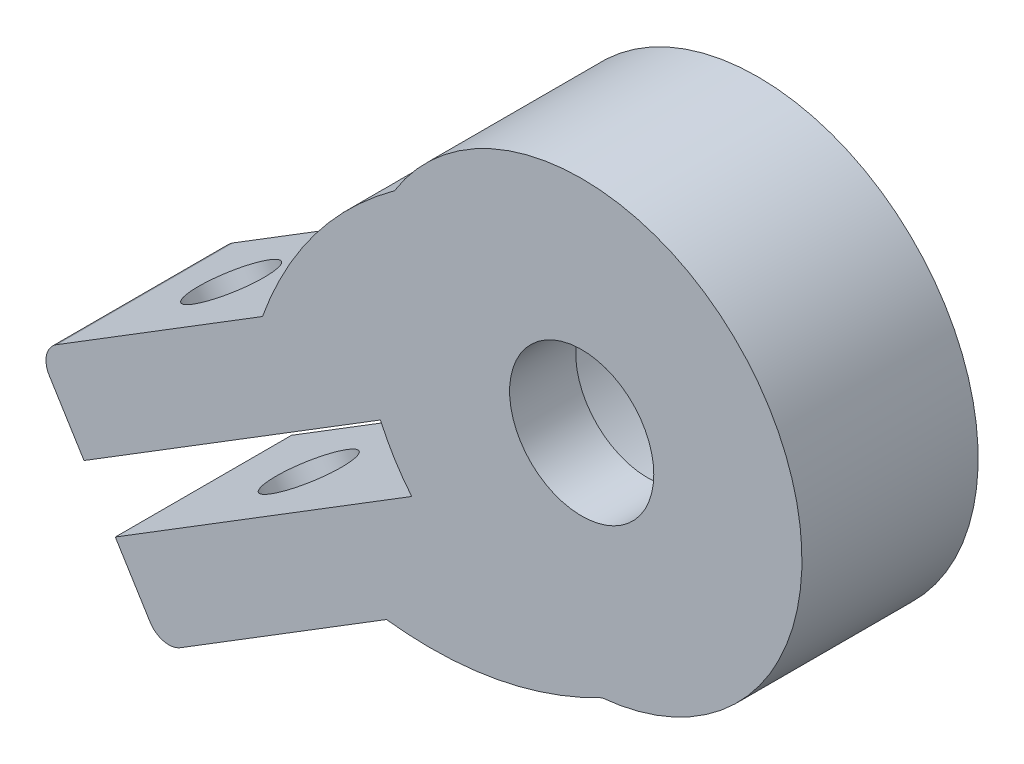
ISO-10303-21;
HEADER;
FILE_DESCRIPTION(('STEP AP214'),'2;1');
FILE_NAME('part.step','',(''),(''),'','','');
FILE_SCHEMA(('AUTOMOTIVE_DESIGN { 1 0 10303 214 1 1 1 1 }'));
ENDSEC;
DATA;
#1=APPLICATION_CONTEXT('core data for automotive mechanical design processes');
#2=APPLICATION_PROTOCOL_DEFINITION('international standard','automotive_design',2000,#1);
#3=PRODUCT_CONTEXT('',#1,'mechanical');
#4=PRODUCT('Part','Part','',(#3));
#5=PRODUCT_RELATED_PRODUCT_CATEGORY('part','',(#4));
#6=PRODUCT_DEFINITION_FORMATION('','',#4);
#7=PRODUCT_DEFINITION_CONTEXT('part definition',#1,'design');
#8=PRODUCT_DEFINITION('design','',#6,#7);
#9=PRODUCT_DEFINITION_SHAPE('','',#8);
#10=(LENGTH_UNIT() NAMED_UNIT(*) SI_UNIT(.MILLI.,.METRE.));
#11=(NAMED_UNIT(*) PLANE_ANGLE_UNIT() SI_UNIT($,.RADIAN.));
#12=(NAMED_UNIT(*) SI_UNIT($,.STERADIAN.) SOLID_ANGLE_UNIT());
#13=UNCERTAINTY_MEASURE_WITH_UNIT(LENGTH_MEASURE(1.E-05),#10,'distance_accuracy_value','');
#14=(GEOMETRIC_REPRESENTATION_CONTEXT(3) GLOBAL_UNCERTAINTY_ASSIGNED_CONTEXT((#13)) GLOBAL_UNIT_ASSIGNED_CONTEXT((#10,
#11,#12)) REPRESENTATION_CONTEXT('',''));
#15=CARTESIAN_POINT('',(0.,0.,0.));
#16=DIRECTION('',(0.,0.,1.));
#17=DIRECTION('',(1.,0.,0.));
#18=AXIS2_PLACEMENT_3D('',#15,#16,#17);
#19=CARTESIAN_POINT('',(-20.0670341495117,12.6316896438471,-1.));
#20=DIRECTION('',(0.526017539457863,-0.850473719865991,0.));
#21=DIRECTION('',(0.850473719865991,0.526017539457863,0.));
#22=AXIS2_PLACEMENT_3D('',#19,#20,#21);
#23=CYLINDRICAL_SURFACE('',#22,1.75);
#24=CARTESIAN_POINT('',(-6.04943891295383,-10.0321865012299,-1.));
#25=DIRECTION('',(0.526017539457863,-0.850473719865991,0.));
#26=DIRECTION('',(0.850473719865991,0.526017539457863,0.));
#27=AXIS2_PLACEMENT_3D('',#24,#25,#26);
#28=CIRCLE('',#27,1.75);
#29=CARTESIAN_POINT('',(-4.56110990318834,-9.11165580717864,-1.));
#30=VERTEX_POINT('',#29);
#31=EDGE_CURVE('E96',#30,#30,#28,.F.);
#32=ORIENTED_EDGE('',*,*,#31,.F.);
#33=EDGE_LOOP('',(#32));
#34=FACE_BOUND('',#33,.T.);
#35=CARTESIAN_POINT('',(-9.5737564273195,-4.33401257813101,-1.));
#36=DIRECTION('',(0.526017539457977,-0.85047371986592,0.));
#37=DIRECTION('',(0.85047371986592,0.526017539457977,0.));
#38=AXIS2_PLACEMENT_3D('',#35,#36,#37);
#39=CIRCLE('',#38,1.75);
#40=CARTESIAN_POINT('',(-9.13700509767211,-4.06388211506115,0.67295481378694));
#41=VERTEX_POINT('',#40);
#42=CARTESIAN_POINT('',(-9.13700509767211,-4.06388211506115,-2.67295481378694));
#43=VERTEX_POINT('',#42);
#44=EDGE_CURVE('E394',#41,#43,#39,.T.);
#45=ORIENTED_EDGE('',*,*,#44,.T.);
#46=CARTESIAN_POINT('',(-9.13700509767211,-4.06388211506115,-2.67295481378694));
#47=CARTESIAN_POINT('',(-9.0910607179758,-4.16718406959697,-2.67762389147435));
#48=CARTESIAN_POINT('',(-9.04335031298703,-4.26973245475617,-2.68151430251616));
#49=CARTESIAN_POINT('',(-8.94446343189451,-4.47318220112726,-2.68796334016017));
#50=CARTESIAN_POINT('',(-8.89328709475151,-4.57408362817011,-2.69052202012022));
#51=CARTESIAN_POINT('',(-8.78779013941502,-4.77361705844955,-2.69452363922069));
#52=CARTESIAN_POINT('',(-8.7334861844887,-4.87225776888833,-2.6959719922968));
#53=CARTESIAN_POINT('',(-8.62157308507197,-5.06765761053142,-2.69788924327426));
#54=CARTESIAN_POINT('',(-8.56396389140243,-5.16441671371032,-2.69835812659805));
#55=CARTESIAN_POINT('',(-8.44551050591582,-5.35593407544946,-2.69835812659804));
#56=CARTESIAN_POINT('',(-8.38466631409875,-5.45069233400969,-2.69788924327424));
#57=CARTESIAN_POINT('',(-8.25981820007442,-5.63809187605762,-2.69597199229676));
#58=CARTESIAN_POINT('',(-8.19581432490623,-5.73073319103081,-2.69452363922064));
#59=CARTESIAN_POINT('',(-8.06440225147341,-5.91423813467112,-2.69052202012015));
#60=CARTESIAN_POINT('',(-7.99697882062953,-6.00509074297654,-2.68796334016009));
#61=CARTESIAN_POINT('',(-7.85911057629518,-6.18443053709605,-2.68151430251606));
#62=CARTESIAN_POINT('',(-7.78866564184246,-6.27291762797888,-2.67762389147424));
#63=CARTESIAN_POINT('',(-7.71675774113556,-6.36016115869907,-2.67295481378682));
#64=B_SPLINE_CURVE_WITH_KNOTS('',3,(#46,#47,#48,#49,#50,#51,#52,#53,#54,#55,#56,#57,#58,#59,#60,
#61,#62,#63),.UNSPECIFIED.,.F.,.F.,(4,2,2,2,2,2,2,2,4),(0.,0.339440738920705,0.678867876579291,
1.01662925696975,1.35439566426521,1.69216207156067,2.02992345195113,2.36935058960971,
2.70879132853042),.UNSPECIFIED.);
#65=CARTESIAN_POINT('',(-7.71675774113556,-6.36016115869907,-2.67295481378682));
#66=VERTEX_POINT('',#65);
#67=EDGE_CURVE('E310',#43,#66,#64,.T.);
#68=ORIENTED_EDGE('',*,*,#67,.T.);
#69=CARTESIAN_POINT('',(-8.1535090707833,-6.63029162176914,-1.));
#70=DIRECTION('',(0.526017539457983,-0.850473719865916,0.));
#71=DIRECTION('',(0.850473719865916,0.526017539457983,0.));
#72=AXIS2_PLACEMENT_3D('',#69,#70,#71);
#73=CIRCLE('',#72,1.75);
#74=CARTESIAN_POINT('',(-7.71675774113556,-6.36016115869907,0.672954813786817));
#75=VERTEX_POINT('',#74);
#76=EDGE_CURVE('E12',#75,#66,#73,.T.);
#77=ORIENTED_EDGE('',*,*,#76,.F.);
#78=CARTESIAN_POINT('',(-7.71675774113556,-6.36016115869907,0.672954813786818));
#79=CARTESIAN_POINT('',(-7.78866564184246,-6.27291762797888,0.677623891474236));
#80=CARTESIAN_POINT('',(-7.85911057629518,-6.18443053709605,0.68151430251606));
#81=CARTESIAN_POINT('',(-7.99697882062953,-6.00509074297654,0.687963340160092));
#82=CARTESIAN_POINT('',(-8.06440225147341,-5.91423813467112,0.690522020120153));
#83=CARTESIAN_POINT('',(-8.19581432490623,-5.7307331910308,0.694523639220642));
#84=CARTESIAN_POINT('',(-8.25981820007442,-5.63809187605762,0.695971992296761));
#85=CARTESIAN_POINT('',(-8.38466631409875,-5.45069233400969,0.697889243274241));
#86=CARTESIAN_POINT('',(-8.44551050591582,-5.35593407544946,0.698358126598042));
#87=CARTESIAN_POINT('',(-8.56396389140243,-5.16441671371032,0.69835812659805));
#88=CARTESIAN_POINT('',(-8.62157308507197,-5.06765761053142,0.697889243274257));
#89=CARTESIAN_POINT('',(-8.7334861844887,-4.87225776888833,0.695971992296795));
#90=CARTESIAN_POINT('',(-8.78779013941502,-4.77361705844955,0.694523639220685));
#91=CARTESIAN_POINT('',(-8.89328709475151,-4.57408362817011,0.690522020120216));
#92=CARTESIAN_POINT('',(-8.94446343189451,-4.47318220112726,0.687963340160165));
#93=CARTESIAN_POINT('',(-9.04335031298703,-4.26973245475617,0.681514302516156));
#94=CARTESIAN_POINT('',(-9.0910607179758,-4.16718406959697,0.677623891474344));
#95=CARTESIAN_POINT('',(-9.13700509767211,-4.06388211506115,0.67295481378694));
#96=B_SPLINE_CURVE_WITH_KNOTS('',3,(#78,#79,#80,#81,#82,#83,#84,#85,#86,#87,#88,#89,#90,#91,#92,
#93,#94,#95),.UNSPECIFIED.,.F.,.F.,(4,2,2,2,2,2,2,2,4),(0.,0.339440738920706,0.678867876579291,
1.01662925696975,1.35439566426521,1.69216207156067,2.02992345195113,2.36935058960971,
2.70879132853042),.UNSPECIFIED.);
#97=EDGE_CURVE('E402',#75,#41,#96,.T.);
#98=ORIENTED_EDGE('',*,*,#97,.T.);
#99=EDGE_LOOP('',(#45,#68,#77,#98));
#100=FACE_BOUND('',#99,.T.);
#101=CARTESIAN_POINT('',(-11.6778265851506,-0.932117698667625,-1.));
#102=DIRECTION('',(-0.526017539457863,0.850473719865991,0.));
#103=DIRECTION('',(-0.850473719865991,-0.526017539457863,0.));
#104=AXIS2_PLACEMENT_3D('',#101,#102,#103);
#105=CIRCLE('',#104,1.75);
#106=CARTESIAN_POINT('',(-13.1661555949161,-1.85264839271889,-1.));
#107=VERTEX_POINT('',#106);
#108=EDGE_CURVE('E222',#107,#107,#105,.F.);
#109=ORIENTED_EDGE('',*,*,#108,.F.);
#110=EDGE_LOOP('',(#109));
#111=FACE_BOUND('',#110,.T.);
#112=ADVANCED_FACE('F91',(#34,#100,#111),#23,.F.);
#113=CARTESIAN_POINT('',(0.920254083057489,-9.95756659142259,27.838654743405));
#114=CARTESIAN_POINT('',(-3.77200392309592,-12.3784621923339,27.838654743405));
#115=CARTESIAN_POINT('',(-8.86441175084651,-11.7732456912333,27.838654743405));
#116=B_SPLINE_CURVE_WITH_KNOTS('',2,(#113,#114,#115),.UNSPECIFIED.,.F.,.F.,(3,3),(0.,1.),.UNSPECIFIED.);
#117=DIRECTION('',(0.,0.,-1.));
#118=VECTOR('',#117,1.);
#119=SURFACE_OF_LINEAR_EXTRUSION('',#116,#118);
#120=DIRECTION('',(0.,0.,-1.));
#121=VECTOR('',#120,1.);
#122=CARTESIAN_POINT('',(-8.86441175084651,-11.7732456912333,27.838654743405));
#123=LINE('',#122,#121);
#124=CARTESIAN_POINT('',(-8.86441175084651,-11.7732456912333,3.));
#125=VERTEX_POINT('',#124);
#126=CARTESIAN_POINT('',(-8.86441175084651,-11.7732456912333,0.13782284158443));
#127=VERTEX_POINT('',#126);
#128=EDGE_CURVE('E473',#125,#127,#123,.T.);
#129=ORIENTED_EDGE('',*,*,#128,.T.);
#130=CARTESIAN_POINT('',(-8.86441175084651,-11.7732456912333,0.137822841584416));
#131=CARTESIAN_POINT('',(-8.78178088037611,-11.7830759715361,0.327218545379615));
#132=CARTESIAN_POINT('',(-8.68053923373417,-11.7945229962121,0.507374773618629));
#133=CARTESIAN_POINT('',(-8.44862217109366,-11.8180616260093,0.845916567357196));
#134=CARTESIAN_POINT('',(-8.31815431394117,-11.8301482477535,1.0044435515616));
#135=CARTESIAN_POINT('',(-8.03498623870755,-11.8525225034823,1.29832846642813));
#136=CARTESIAN_POINT('',(-7.88240628702935,-11.8628192455073,1.43380362010848));
#137=CARTESIAN_POINT('',(-7.5592444828786,-11.8797205776163,1.68218934454834));
#138=CARTESIAN_POINT('',(-7.38862352391518,-11.886316943192,1.79504929565848));
#139=CARTESIAN_POINT('',(-7.00451009414908,-11.8947839717756,2.01373316801826));
#140=CARTESIAN_POINT('',(-6.78858660450014,-11.8956965307021,2.11533137487465));
#141=CARTESIAN_POINT('',(-6.343858034518,-11.8882395240412,2.28462988327816));
#142=CARTESIAN_POINT('',(-6.11505194166355,-11.8798692278891,2.35232751622647));
#143=CARTESIAN_POINT('',(-5.75872012779931,-11.8590247321965,2.42831029516039));
#144=CARTESIAN_POINT('',(-5.63361872835202,-11.850273626802,2.44958285057473));
#145=CARTESIAN_POINT('',(-5.38231487589028,-11.8297304393406,2.48135464254085));
#146=CARTESIAN_POINT('',(-5.25611287353542,-11.8179395502315,2.49185809737708));
#147=CARTESIAN_POINT('',(-5.0035883207517,-11.7913335681812,2.50168855611812));
#148=CARTESIAN_POINT('',(-4.8772657687764,-11.776518435911,2.50101541466646));
#149=CARTESIAN_POINT('',(-4.62558295174889,-11.7439929702566,2.48811938132056));
#150=CARTESIAN_POINT('',(-4.50022258516097,-11.7262829468822,2.4758977254706));
#151=CARTESIAN_POINT('',(-4.26041661028451,-11.6895610924857,2.44089096867987));
#152=CARTESIAN_POINT('',(-4.14582548101767,-11.6707295652989,2.41891296183978));
#153=CARTESIAN_POINT('',(-3.91948599055489,-11.6310786253154,2.36457896995024));
#154=CARTESIAN_POINT('',(-3.80773726635139,-11.6102594679923,2.33222431737233));
#155=CARTESIAN_POINT('',(-3.58817144120457,-11.5670346939342,2.25712590071114));
#156=CARTESIAN_POINT('',(-3.48035212228732,-11.5446299938567,2.21438810526687));
#157=CARTESIAN_POINT('',(-3.26963354299221,-11.4987020940164,2.11862341772098));
#158=CARTESIAN_POINT('',(-3.16673375219554,-11.4751790153839,2.06559763799244));
#159=CARTESIAN_POINT('',(-2.97753742124822,-11.4301038802029,1.955713466488));
#160=CARTESIAN_POINT('',(-2.89063966813169,-11.4086086675787,1.89986444629629));
#161=CARTESIAN_POINT('',(-2.72227380249337,-11.3655889694713,1.7804483142072));
#162=CARTESIAN_POINT('',(-2.64080747183837,-11.3440644767223,1.71687868855065));
#163=CARTESIAN_POINT('',(-2.48406416893797,-11.3014613880483,1.58248970251672));
#164=CARTESIAN_POINT('',(-2.40878303925684,-11.2803824998025,1.51167528487062));
#165=CARTESIAN_POINT('',(-2.26493524675762,-11.2391059026767,1.36323561339658));
#166=CARTESIAN_POINT('',(-2.19637096847206,-11.2189085081344,1.28560795922758));
#167=CARTESIAN_POINT('',(-2.07070067221002,-11.1811049096391,1.12933358716422));
#168=CARTESIAN_POINT('',(-2.01314208161916,-11.1634155978519,1.05107039257222));
#169=CARTESIAN_POINT('',(-1.90479283912813,-11.1295543285125,0.889639515630325));
#170=CARTESIAN_POINT('',(-1.85400458791087,-11.1133829097856,0.806470108594692));
#171=CARTESIAN_POINT('',(-1.75958519317525,-11.0828961191735,0.635887039698031));
#172=CARTESIAN_POINT('',(-1.71595049048878,-11.0685798250394,0.548475516683772));
#173=CARTESIAN_POINT('',(-1.63608316927644,-11.0420765947998,0.37001281510195));
#174=CARTESIAN_POINT('',(-1.59985326882917,-11.0298904408408,0.278960314652816));
#175=CARTESIAN_POINT('',(-1.50405696335892,-10.9973928407109,0.00533468609717166));
#176=CARTESIAN_POINT('',(-1.4552659006964,-10.9804421367483,-0.181564115495067));
#177=CARTESIAN_POINT('',(-1.38822031506136,-10.9570226006385,-0.561291615197718));
#178=CARTESIAN_POINT('',(-1.36996488141886,-10.9505534558977,-0.754120136290284));
#179=CARTESIAN_POINT('',(-1.36436066165777,-10.9485748877065,-1.13952957798576));
#180=CARTESIAN_POINT('',(-1.37688800020314,-10.9530215370933,-1.33210838090526));
#181=CARTESIAN_POINT('',(-1.43232039882854,-10.9724493730393,-1.71228963046792));
#182=CARTESIAN_POINT('',(-1.47522500395593,-10.9874304018277,-1.89989215159593));
#183=CARTESIAN_POINT('',(-1.59040539555551,-11.0267814728813,-2.26478201827147));
#184=CARTESIAN_POINT('',(-1.6626766834401,-11.0511500770642,-2.44207093897319));
#185=CARTESIAN_POINT('',(-1.83483914637827,-11.1074198548621,-2.7813710605049));
#186=CARTESIAN_POINT('',(-1.93472944109315,-11.1393207883841,-2.94338274806652));
#187=CARTESIAN_POINT('',(-2.1598886074771,-11.2083359440995,-3.24811679190907));
#188=CARTESIAN_POINT('',(-2.28522516045628,-11.2454639867528,-3.39078597737143));
#189=CARTESIAN_POINT('',(-2.55773628943789,-11.3221065272683,-3.65266028311185));
#190=CARTESIAN_POINT('',(-2.70491093183194,-11.3616210323854,-3.77186533205229));
#191=CARTESIAN_POINT('',(-3.01942305037594,-11.4408397663277,-3.98581234954798));
#192=CARTESIAN_POINT('',(-3.18703180352206,-11.480537826275,-4.08015707501946));
#193=CARTESIAN_POINT('',(-3.53590708349335,-11.5568872076107,-4.24049390785147));
#194=CARTESIAN_POINT('',(-3.71717591860227,-11.5935380118626,-4.30648121068421));
#195=CARTESIAN_POINT('',(-4.09710626429739,-11.6632781370855,-4.41216463036999));
#196=CARTESIAN_POINT('',(-4.29618417343125,-11.6961270094639,-4.45051607908114));
#197=CARTESIAN_POINT('',(-4.69884299083289,-11.7546651688177,-4.49664896804271));
#198=CARTESIAN_POINT('',(-4.90242535429713,-11.7803521045222,-4.50442037979101));
#199=CARTESIAN_POINT('',(-5.32707129056604,-11.8257290440858,-4.49026689318963));
#200=CARTESIAN_POINT('',(-5.54812154612585,-11.8447068310215,-4.46571129336459));
#201=CARTESIAN_POINT('',(-5.98486236758126,-11.8734102972224,-4.38443553061552));
#202=CARTESIAN_POINT('',(-6.20054983189154,-11.8831307383665,-4.32769718653471));
#203=CARTESIAN_POINT('',(-6.64328279111815,-11.8947132194972,-4.17678333175036));
#204=CARTESIAN_POINT('',(-6.86925960024632,-11.8956776531801,-4.07939291316566));
#205=CARTESIAN_POINT('',(-7.30304742215655,-11.8893580328762,-3.84999576050926));
#206=CARTESIAN_POINT('',(-7.51084751803581,-11.8820690580548,-3.71796841133531));
#207=CARTESIAN_POINT('',(-7.87585504945109,-11.863308470188,-3.43997722034864));
#208=CARTESIAN_POINT('',(-8.03613170664472,-11.8524961399101,-3.29799580237145));
#209=CARTESIAN_POINT('',(-8.33108457187924,-11.8290593537432,-2.9901276080456));
#210=CARTESIAN_POINT('',(-8.46584780663779,-11.8164413256024,-2.82432561793918));
#211=CARTESIAN_POINT('',(-8.63821333451365,-11.7987421707126,-2.56706150171908));
#212=CARTESIAN_POINT('',(-8.68880992036758,-11.793292589966,-2.48418229309875));
#213=CARTESIAN_POINT('',(-8.78247280283247,-11.7828534754795,-2.31412743480398));
#214=CARTESIAN_POINT('',(-8.82553026001335,-11.7778644849655,-2.22694689334941));
#215=CARTESIAN_POINT('',(-8.86441175084651,-11.7732456912333,-2.13782284158444));
#216=B_SPLINE_CURVE_WITH_KNOTS('',3,(#130,#131,#132,#133,#134,#135,#136,#137,#138,#139,#140,
#141,#142,#143,#144,#145,#146,#147,#148,#149,#150,#151,#152,#153,#154,#155,#156,#157,#158,#159,
#160,#161,#162,#163,#164,#165,#166,#167,#168,#169,#170,#171,#172,#173,#174,#175,#176,#177,#178,
#179,#180,#181,#182,#183,#184,#185,#186,#187,#188,#189,#190,#191,#192,#193,#194,#195,#196,#197,
#198,#199,#200,#201,#202,#203,#204,#205,#206,#207,#208,#209,#210,#211,#212,#213,#214,#215),
.UNSPECIFIED.,.F.,.F.,(4,2,2,2,2,2,2,2,2,2,2,2,2,2,2,2,2,2,2,2,2,2,2,2,2,2,2,2,2,2,2,2,2,2,2,2,
2,2,2,2,2,2,4),(0.,0.618219014274065,1.23217942155969,1.84291782467277,2.45500833910185,
3.16798532786133,3.88101843220662,4.2621966305036,4.64322546321016,5.02425925136554,
5.40525226186942,5.7593348351853,6.11337195873033,6.46720604734831,6.82100189947787,
7.13712394892676,7.45334920217789,7.76936013276382,8.08548284611181,8.38136388695477,
8.67734956624236,8.97318753127871,9.26913389520777,9.84783243515696,10.4265137161596,
11.0028700975586,11.5792178471961,12.1554773412412,12.7317184694897,13.3095128355369,
13.887308958216,14.4738436086123,15.0604775949784,15.6740177690214,16.2877591323698,
16.9546647102135,17.6219474221026,18.3569482098796,19.0923874495465,19.733145932704,
20.3716777644934,20.6631071871527,20.9548760478202),.UNSPECIFIED.);
#217=CARTESIAN_POINT('',(-8.86441175084651,-11.7732456912333,-2.13782284158443));
#218=VERTEX_POINT('',#217);
#219=EDGE_CURVE('E301',#127,#218,#216,.T.);
#220=ORIENTED_EDGE('',*,*,#219,.T.);
#221=CARTESIAN_POINT('',(-8.86441175084651,-11.7732456912333,-5.));
#222=VERTEX_POINT('',#221);
#223=EDGE_CURVE('E455',#218,#222,#123,.T.);
#224=ORIENTED_EDGE('',*,*,#223,.T.);
#225=CARTESIAN_POINT('',(0.920254083057489,-9.95756659142259,-5.));
#226=CARTESIAN_POINT('',(-3.77200392309592,-12.3784621923339,-5.));
#227=CARTESIAN_POINT('',(-8.86441175084651,-11.7732456912333,-5.));
#228=B_SPLINE_CURVE_WITH_KNOTS('',2,(#225,#226,#227),.UNSPECIFIED.,.F.,.F.,(3,3),(0.,1.),.UNSPECIFIED.);
#229=CARTESIAN_POINT('',(0.920254083057494,-9.95756659142262,-5.));
#230=VERTEX_POINT('',#229);
#231=EDGE_CURVE('E441',#230,#222,#228,.T.);
#232=ORIENTED_EDGE('',*,*,#231,.F.);
#233=DIRECTION('',(0.,0.,-1.));
#234=VECTOR('',#233,1.);
#235=CARTESIAN_POINT('',(0.920254083057494,-9.95756659142262,27.838654743405));
#236=LINE('',#235,#234);
#237=CARTESIAN_POINT('',(0.920254083057494,-9.95756659142265,3.));
#238=VERTEX_POINT('',#237);
#239=EDGE_CURVE('E265',#238,#230,#236,.T.);
#240=ORIENTED_EDGE('',*,*,#239,.F.);
#241=CARTESIAN_POINT('',(0.920254083057489,-9.95756659142259,3.));
#242=CARTESIAN_POINT('',(-3.77200392309592,-12.3784621923339,3.));
#243=CARTESIAN_POINT('',(-8.86441175084651,-11.7732456912333,3.));
#244=B_SPLINE_CURVE_WITH_KNOTS('',2,(#241,#242,#243),.UNSPECIFIED.,.F.,.F.,(3,3),(0.,1.),.UNSPECIFIED.);
#245=EDGE_CURVE('E436',#238,#125,#244,.T.);
#246=ORIENTED_EDGE('',*,*,#245,.T.);
#247=EDGE_LOOP('',(#129,#220,#224,#232,#240,#246));
#248=FACE_BOUND('',#247,.T.);
#249=ADVANCED_FACE('F316',(#248),#119,.T.);
#250=CARTESIAN_POINT('',(0.,0.,-5.));
#251=DIRECTION('',(0.,0.,1.));
#252=DIRECTION('',(1.,0.,0.));
#253=AXIS2_PLACEMENT_3D('',#250,#251,#252);
#254=CYLINDRICAL_SURFACE('',#253,10.);
#255=ORIENTED_EDGE('',*,*,#97,.F.);
#256=DIRECTION('',(0.,0.,-1.));
#257=VECTOR('',#256,1.);
#258=CARTESIAN_POINT('',(-7.71675774113556,-6.36016115869907,27.838654743405));
#259=LINE('',#258,#257);
#260=CARTESIAN_POINT('',(-7.71675774113556,-6.36016115869907,3.));
#261=VERTEX_POINT('',#260);
#262=EDGE_CURVE('E425',#261,#75,#259,.T.);
#263=ORIENTED_EDGE('',*,*,#262,.F.);
#264=CARTESIAN_POINT('',(0.,0.,3.));
#265=DIRECTION('',(0.,0.,1.));
#266=DIRECTION('',(1.,0.,0.));
#267=AXIS2_PLACEMENT_3D('',#264,#265,#266);
#268=CIRCLE('',#267,10.);
#269=CARTESIAN_POINT('',(-9.13700509767207,-4.06388211506113,3.));
#270=VERTEX_POINT('',#269);
#271=EDGE_CURVE('E547',#270,#261,#268,.T.);
#272=ORIENTED_EDGE('',*,*,#271,.F.);
#273=DIRECTION('',(0.,0.,-1.));
#274=VECTOR('',#273,1.);
#275=CARTESIAN_POINT('',(-9.13700509767211,-4.06388211506115,27.838654743405));
#276=LINE('',#275,#274);
#277=EDGE_CURVE('E256',#270,#41,#276,.T.);
#278=ORIENTED_EDGE('',*,*,#277,.T.);
#279=EDGE_LOOP('',(#255,#263,#272,#278));
#280=FACE_BOUND('',#279,.T.);
#281=ADVANCED_FACE('F322',(#280),#254,.T.);
#282=ORIENTED_EDGE('',*,*,#67,.F.);
#283=CARTESIAN_POINT('',(-9.13700509767211,-4.06388211506115,-5.));
#284=VERTEX_POINT('',#283);
#285=EDGE_CURVE('E254',#43,#284,#276,.T.);
#286=ORIENTED_EDGE('',*,*,#285,.T.);
#287=CARTESIAN_POINT('',(0.,0.,-5.));
#288=DIRECTION('',(0.,0.,1.));
#289=DIRECTION('',(1.,0.,0.));
#290=AXIS2_PLACEMENT_3D('',#287,#288,#289);
#291=CIRCLE('',#290,10.);
#292=CARTESIAN_POINT('',(-7.71675774113556,-6.36016115869907,-5.));
#293=VERTEX_POINT('',#292);
#294=EDGE_CURVE('E102',#284,#293,#291,.T.);
#295=ORIENTED_EDGE('',*,*,#294,.T.);
#296=EDGE_CURVE('E430',#66,#293,#259,.T.);
#297=ORIENTED_EDGE('',*,*,#296,.F.);
#298=EDGE_LOOP('',(#282,#286,#295,#297));
#299=FACE_BOUND('',#298,.T.);
#300=ADVANCED_FACE('F502',(#299),#254,.T.);
#301=ORIENTED_EDGE('',*,*,#239,.T.);
#302=CARTESIAN_POINT('',(-8.49831981825614,5.27053699983549,-5.));
#303=VERTEX_POINT('',#302);
#304=EDGE_CURVE('E377',#230,#303,#291,.T.);
#305=ORIENTED_EDGE('',*,*,#304,.T.);
#306=DIRECTION('',(0.,0.,-1.));
#307=VECTOR('',#306,1.);
#308=CARTESIAN_POINT('',(-8.49831981825614,5.27053699983549,27.838654743405));
#309=LINE('',#308,#307);
#310=CARTESIAN_POINT('',(-8.49831981825614,5.27053699983549,3.));
#311=VERTEX_POINT('',#310);
#312=EDGE_CURVE('E261',#311,#303,#309,.T.);
#313=ORIENTED_EDGE('',*,*,#312,.F.);
#314=EDGE_CURVE('E371',#238,#311,#268,.T.);
#315=ORIENTED_EDGE('',*,*,#314,.F.);
#316=EDGE_LOOP('',(#301,#305,#313,#315));
#317=FACE_BOUND('',#316,.T.);
#318=ADVANCED_FACE('F93',(#317),#254,.T.);
#319=CARTESIAN_POINT('',(0.,0.,-5.));
#320=DIRECTION('',(0.,0.,1.));
#321=DIRECTION('',(1.,0.,0.));
#322=AXIS2_PLACEMENT_3D('',#319,#320,#321);
#323=PLANE('',#322);
#324=CARTESIAN_POINT('',(0.,0.,-5.));
#325=DIRECTION('',(0.,0.,1.));
#326=DIRECTION('',(1.,0.,0.));
#327=AXIS2_PLACEMENT_3D('',#324,#325,#326);
#328=CIRCLE('',#327,6.925);
#329=CARTESIAN_POINT('',(6.925,0.,-5.));
#330=VERTEX_POINT('',#329);
#331=EDGE_CURVE('E381',#330,#330,#328,.T.);
#332=ORIENTED_EDGE('',*,*,#331,.T.);
#333=EDGE_LOOP('',(#332));
#334=FACE_BOUND('',#333,.T.);
#335=ORIENTED_EDGE('',*,*,#294,.F.);
#336=DIRECTION('',(-0.85047371986592,-0.526017539457977,0.));
#337=VECTOR('',#336,1.);
#338=CARTESIAN_POINT('',(-0.710123678268181,1.14813952181885,-5.));
#339=LINE('',#338,#337);
#340=CARTESIAN_POINT('',(-22.594413903603,-12.3872822416305,-5.));
#341=VERTEX_POINT('',#340);
#342=EDGE_CURVE('E260',#284,#341,#339,.T.);
#343=ORIENTED_EDGE('',*,*,#342,.T.);
#344=DIRECTION('',(0.526017539457865,-0.85047371986599,0.));
#345=VECTOR('',#344,1.);
#346=CARTESIAN_POINT('',(-21.8842902253368,-13.5354217634465,-5.));
#347=LINE('',#346,#345);
#348=CARTESIAN_POINT('',(-24.1724665219774,-9.83586108203113,-5.));
#349=VERTEX_POINT('',#348);
#350=EDGE_CURVE('E250',#349,#341,#347,.T.);
#351=ORIENTED_EDGE('',*,*,#350,.F.);
#352=CARTESIAN_POINT('',(-23.3219928021114,-9.30984354257327,-5.));
#353=DIRECTION('',(0.,0.,-1.));
#354=DIRECTION('',(-1.,0.,0.));
#355=AXIS2_PLACEMENT_3D('',#352,#353,#354);
#356=CIRCLE('',#355,1.);
#357=CARTESIAN_POINT('',(-23.8480103415693,-8.45936982270728,-5.));
#358=VERTEX_POINT('',#357);
#359=EDGE_CURVE('E246',#358,#349,#356,.F.);
#360=ORIENTED_EDGE('',*,*,#359,.F.);
#361=DIRECTION('',(-0.850473719865991,-0.526017539457863,0.));
#362=VECTOR('',#361,1.);
#363=CARTESIAN_POINT('',(-2.81419383609851,4.55003440128134,-5.));
#364=LINE('',#363,#362);
#365=CARTESIAN_POINT('',(-14.4927994230434,-2.67317688867078,-5.));
#366=VERTEX_POINT('',#365);
#367=EDGE_CURVE('E230',#366,#358,#364,.T.);
#368=ORIENTED_EDGE('',*,*,#367,.F.);
#369=CARTESIAN_POINT('',(-8.49831981825629,5.27053699983558,-5.));
#370=CARTESIAN_POINT('',(-12.7599778427212,2.15344033958648,-5.));
#371=CARTESIAN_POINT('',(-14.4927994230434,-2.67317688867078,-5.));
#372=B_SPLINE_CURVE_WITH_KNOTS('',2,(#369,#370,#371),.UNSPECIFIED.,.F.,.F.,(3,3),(0.,1.),.UNSPECIFIED.);
#373=EDGE_CURVE('E237',#303,#366,#372,.T.);
#374=ORIENTED_EDGE('',*,*,#373,.F.);
#375=ORIENTED_EDGE('',*,*,#304,.F.);
#376=ORIENTED_EDGE('',*,*,#231,.T.);
#377=DIRECTION('',(-0.850473719865991,-0.526017539457863,0.));
#378=VECTOR('',#377,1.);
#379=CARTESIAN_POINT('',(2.81419383609839,-4.55003440128114,-5.));
#380=LINE('',#379,#378);
#381=CARTESIAN_POINT('',(-18.2196226693724,-17.5594386252698,-5.));
#382=VERTEX_POINT('',#381);
#383=EDGE_CURVE('E437',#222,#382,#380,.T.);
#384=ORIENTED_EDGE('',*,*,#383,.T.);
#385=CARTESIAN_POINT('',(-18.7456402088303,-16.7089649054038,-5.));
#386=DIRECTION('',(0.,0.,-1.));
#387=DIRECTION('',(-1.,0.,0.));
#388=AXIS2_PLACEMENT_3D('',#385,#386,#387);
#389=CIRCLE('',#388,1.);
#390=CARTESIAN_POINT('',(-19.5961139286963,-17.2349824448616,-5.));
#391=VERTEX_POINT('',#390);
#392=EDGE_CURVE('E432',#382,#391,#389,.T.);
#393=ORIENTED_EDGE('',*,*,#392,.T.);
#394=DIRECTION('',(0.526017539457862,-0.850473719865991,0.));
#395=VECTOR('',#394,1.);
#396=CARTESIAN_POINT('',(-21.8842902253368,-13.5354217634465,-5.));
#397=LINE('',#396,#395);
#398=CARTESIAN_POINT('',(-21.1741665470667,-14.6835612852687,-5.));
#399=VERTEX_POINT('',#398);
#400=EDGE_CURVE('E426',#399,#391,#397,.T.);
#401=ORIENTED_EDGE('',*,*,#400,.F.);
#402=DIRECTION('',(-0.850473719865916,-0.526017539457983,0.));
#403=VECTOR('',#402,1.);
#404=CARTESIAN_POINT('',(0.710123678268302,-1.14813952181903,-5.));
#405=LINE('',#404,#403);
#406=EDGE_CURVE('E421',#293,#399,#405,.T.);
#407=ORIENTED_EDGE('',*,*,#406,.F.);
#408=EDGE_LOOP('',(#335,#343,#351,#360,#368,#374,#375,#376,#384,#393,#401,#407));
#409=FACE_BOUND('',#408,.T.);
#410=ADVANCED_FACE('F490',(#334,#409),#323,.F.);
#411=CARTESIAN_POINT('',(0.,0.,-5.));
#412=DIRECTION('',(0.,0.,1.));
#413=DIRECTION('',(1.,0.,0.));
#414=AXIS2_PLACEMENT_3D('',#411,#412,#413);
#415=CYLINDRICAL_SURFACE('',#414,6.925);
#416=ORIENTED_EDGE('',*,*,#331,.F.);
#417=EDGE_LOOP('',(#416));
#418=FACE_BOUND('',#417,.T.);
#419=CARTESIAN_POINT('',(0.,0.,0.));
#420=DIRECTION('',(0.,0.,1.));
#421=DIRECTION('',(1.,0.,0.));
#422=AXIS2_PLACEMENT_3D('',#419,#420,#421);
#423=CIRCLE('',#422,6.925);
#424=CARTESIAN_POINT('',(6.925,0.,0.));
#425=VERTEX_POINT('',#424);
#426=EDGE_CURVE('E387',#425,#425,#423,.T.);
#427=ORIENTED_EDGE('',*,*,#426,.T.);
#428=EDGE_LOOP('',(#427));
#429=FACE_BOUND('',#428,.T.);
#430=ADVANCED_FACE('F493',(#418,#429),#415,.F.);
#431=CARTESIAN_POINT('',(0.,0.,0.));
#432=DIRECTION('',(0.,0.,1.));
#433=DIRECTION('',(1.,0.,0.));
#434=AXIS2_PLACEMENT_3D('',#431,#432,#433);
#435=PLANE('',#434);
#436=CARTESIAN_POINT('',(0.,0.,0.));
#437=DIRECTION('',(0.,0.,1.));
#438=DIRECTION('',(1.,0.,0.));
#439=AXIS2_PLACEMENT_3D('',#436,#437,#438);
#440=CIRCLE('',#439,3.2729396667726);
#441=CARTESIAN_POINT('',(3.27293966677265,0.,0.));
#442=VERTEX_POINT('',#441);
#443=EDGE_CURVE('E359',#442,#442,#440,.T.);
#444=ORIENTED_EDGE('',*,*,#443,.T.);
#445=EDGE_LOOP('',(#444));
#446=FACE_BOUND('',#445,.T.);
#447=ORIENTED_EDGE('',*,*,#426,.F.);
#448=EDGE_LOOP('',(#447));
#449=FACE_BOUND('',#448,.T.);
#450=ADVANCED_FACE('F499',(#446,#449),#435,.F.);
#451=CARTESIAN_POINT('',(0.,0.,3.));
#452=DIRECTION('',(0.,0.,1.));
#453=DIRECTION('',(1.,0.,0.));
#454=AXIS2_PLACEMENT_3D('',#451,#452,#453);
#455=PLANE('',#454);
#456=ORIENTED_EDGE('',*,*,#271,.T.);
#457=DIRECTION('',(-0.850473719865916,-0.526017539457983,0.));
#458=VECTOR('',#457,1.);
#459=CARTESIAN_POINT('',(0.710123678268302,-1.14813952181903,3.));
#460=LINE('',#459,#458);
#461=CARTESIAN_POINT('',(-21.1741665470667,-14.6835612852687,3.));
#462=VERTEX_POINT('',#461);
#463=EDGE_CURVE('E420',#261,#462,#460,.T.);
#464=ORIENTED_EDGE('',*,*,#463,.T.);
#465=DIRECTION('',(0.526017539457862,-0.850473719865991,0.));
#466=VECTOR('',#465,1.);
#467=CARTESIAN_POINT('',(-21.8842902253368,-13.5354217634465,3.));
#468=LINE('',#467,#466);
#469=CARTESIAN_POINT('',(-19.5961139286963,-17.2349824448616,3.));
#470=VERTEX_POINT('',#469);
#471=EDGE_CURVE('E446',#462,#470,#468,.T.);
#472=ORIENTED_EDGE('',*,*,#471,.T.);
#473=CARTESIAN_POINT('',(-18.7456402088303,-16.7089649054038,3.));
#474=DIRECTION('',(0.,0.,1.));
#475=DIRECTION('',(1.,0.,0.));
#476=AXIS2_PLACEMENT_3D('',#473,#474,#475);
#477=CIRCLE('',#476,1.);
#478=CARTESIAN_POINT('',(-18.2196226693724,-17.5594386252698,3.));
#479=VERTEX_POINT('',#478);
#480=EDGE_CURVE('E463',#479,#470,#477,.F.);
#481=ORIENTED_EDGE('',*,*,#480,.F.);
#482=DIRECTION('',(-0.850473719865991,-0.526017539457863,0.));
#483=VECTOR('',#482,1.);
#484=CARTESIAN_POINT('',(2.81419383609839,-4.55003440128114,3.));
#485=LINE('',#484,#483);
#486=EDGE_CURVE('E469',#125,#479,#485,.T.);
#487=ORIENTED_EDGE('',*,*,#486,.F.);
#488=ORIENTED_EDGE('',*,*,#245,.F.);
#489=ORIENTED_EDGE('',*,*,#314,.T.);
#490=CARTESIAN_POINT('',(-8.49831981825629,5.27053699983558,3.));
#491=CARTESIAN_POINT('',(-12.7599778427212,2.15344033958648,3.));
#492=CARTESIAN_POINT('',(-14.4927994230434,-2.67317688867078,3.));
#493=B_SPLINE_CURVE_WITH_KNOTS('',2,(#490,#491,#492),.UNSPECIFIED.,.F.,.F.,(3,3),(0.,1.),.UNSPECIFIED.);
#494=CARTESIAN_POINT('',(-14.4927994230434,-2.67317688867078,3.));
#495=VERTEX_POINT('',#494);
#496=EDGE_CURVE('E240',#311,#495,#493,.T.);
#497=ORIENTED_EDGE('',*,*,#496,.T.);
#498=DIRECTION('',(-0.850473719865991,-0.526017539457863,0.));
#499=VECTOR('',#498,1.);
#500=CARTESIAN_POINT('',(-2.81419383609851,4.55003440128134,3.));
#501=LINE('',#500,#499);
#502=CARTESIAN_POINT('',(-23.8480103415693,-8.45936982270728,3.));
#503=VERTEX_POINT('',#502);
#504=EDGE_CURVE('E228',#495,#503,#501,.T.);
#505=ORIENTED_EDGE('',*,*,#504,.T.);
#506=CARTESIAN_POINT('',(-23.3219928021114,-9.30984354257327,3.));
#507=DIRECTION('',(0.,0.,1.));
#508=DIRECTION('',(1.,0.,0.));
#509=AXIS2_PLACEMENT_3D('',#506,#507,#508);
#510=CIRCLE('',#509,1.);
#511=CARTESIAN_POINT('',(-24.1724665219774,-9.83586108203113,3.));
#512=VERTEX_POINT('',#511);
#513=EDGE_CURVE('E360',#503,#512,#510,.T.);
#514=ORIENTED_EDGE('',*,*,#513,.T.);
#515=DIRECTION('',(0.526017539457865,-0.85047371986599,0.));
#516=VECTOR('',#515,1.);
#517=CARTESIAN_POINT('',(-21.8842902253368,-13.5354217634465,3.));
#518=LINE('',#517,#516);
#519=CARTESIAN_POINT('',(-22.594413903603,-12.3872822416305,3.));
#520=VERTEX_POINT('',#519);
#521=EDGE_CURVE('E355',#512,#520,#518,.T.);
#522=ORIENTED_EDGE('',*,*,#521,.T.);
#523=DIRECTION('',(-0.85047371986592,-0.526017539457977,0.));
#524=VECTOR('',#523,1.);
#525=CARTESIAN_POINT('',(-0.710123678268181,1.14813952181885,3.));
#526=LINE('',#525,#524);
#527=EDGE_CURVE('E255',#270,#520,#526,.T.);
#528=ORIENTED_EDGE('',*,*,#527,.F.);
#529=EDGE_LOOP('',(#456,#464,#472,#481,#487,#488,#489,#497,#505,#514,#522,#528));
#530=FACE_BOUND('',#529,.T.);
#531=CARTESIAN_POINT('',(0.,0.,3.));
#532=DIRECTION('',(0.,0.,1.));
#533=DIRECTION('',(1.,0.,0.));
#534=AXIS2_PLACEMENT_3D('',#531,#532,#533);
#535=CIRCLE('',#534,3.2729396667726);
#536=CARTESIAN_POINT('',(3.27293966677265,0.,3.));
#537=VERTEX_POINT('',#536);
#538=EDGE_CURVE('E270',#537,#537,#535,.T.);
#539=ORIENTED_EDGE('',*,*,#538,.F.);
#540=EDGE_LOOP('',(#539));
#541=FACE_BOUND('',#540,.T.);
#542=ADVANCED_FACE('F367',(#530,#541),#455,.T.);
#543=CARTESIAN_POINT('',(0.,0.,3.));
#544=DIRECTION('',(0.,0.,-1.));
#545=DIRECTION('',(-1.,0.,0.));
#546=AXIS2_PLACEMENT_3D('',#543,#544,#545);
#547=CYLINDRICAL_SURFACE('',#546,3.2729396667726);
#548=ORIENTED_EDGE('',*,*,#538,.T.);
#549=EDGE_LOOP('',(#548));
#550=FACE_BOUND('',#549,.T.);
#551=ORIENTED_EDGE('',*,*,#443,.F.);
#552=EDGE_LOOP('',(#551));
#553=FACE_BOUND('',#552,.T.);
#554=ADVANCED_FACE('F280',(#550,#553),#547,.F.);
#555=CARTESIAN_POINT('',(-8.49831981825629,5.27053699983558,27.838654743405));
#556=CARTESIAN_POINT('',(-12.7599778427212,2.15344033958648,27.838654743405));
#557=CARTESIAN_POINT('',(-14.4927994230434,-2.67317688867078,27.838654743405));
#558=B_SPLINE_CURVE_WITH_KNOTS('',2,(#555,#556,#557),.UNSPECIFIED.,.F.,.F.,(3,3),(0.,1.),.UNSPECIFIED.);
#559=DIRECTION('',(0.,0.,-1.));
#560=VECTOR('',#559,1.);
#561=SURFACE_OF_LINEAR_EXTRUSION('',#558,#560);
#562=DIRECTION('',(0.,0.,-1.));
#563=VECTOR('',#562,1.);
#564=CARTESIAN_POINT('',(-14.4927994230434,-2.67317688867078,27.838654743405));
#565=LINE('',#564,#563);
#566=CARTESIAN_POINT('',(-14.4927994230434,-2.67317688867078,-2.13782284158443));
#567=VERTEX_POINT('',#566);
#568=EDGE_CURVE('E220',#567,#366,#565,.T.);
#569=ORIENTED_EDGE('',*,*,#568,.F.);
#570=CARTESIAN_POINT('',(-14.4927994230434,-2.67317688867078,-2.13782284158443));
#571=CARTESIAN_POINT('',(-14.464690988262,-2.59485440748134,-2.32721854537963));
#572=CARTESIAN_POINT('',(-14.4297173210922,-2.49915828429237,-2.50737477361865));
#573=CARTESIAN_POINT('',(-14.3472012630433,-2.28114293804216,-2.84591656735721));
#574=CARTESIAN_POINT('',(-14.2997471114801,-2.15901164936243,-3.00444355156162));
#575=CARTESIAN_POINT('',(-14.1932999842079,-1.89566059991241,-3.29832846642814));
#576=CARTESIAN_POINT('',(-14.1343688700295,-1.75454437713082,-3.4338036201085));
#577=CARTESIAN_POINT('',(-14.00516332061,-1.45785407953376,-3.68218934454835));
#578=CARTESIAN_POINT('',(-13.9348640612768,-1.30224868819527,-3.79504929565849));
#579=CARTESIAN_POINT('',(-13.7708904304141,-0.954790106661564,-4.01373316801827));
#580=CARTESIAN_POINT('',(-13.6752730961647,-0.76118971529568,-4.11533137487466));
#581=CARTESIAN_POINT('',(-13.46998038789,-0.366608910091088,-4.28462988327816));
#582=CARTESIAN_POINT('',(-13.3603039080044,-0.165627916599419,-4.35232751622648));
#583=CARTESIAN_POINT('',(-13.1825120081046,0.143882818113471,-4.4283102951604));
#584=CARTESIAN_POINT('',(-13.1188104742768,0.251906225656823,-4.44958285057474));
#585=CARTESIAN_POINT('',(-12.9881948163356,0.467580050479811,-4.48135464254086));
#586=CARTESIAN_POINT('',(-12.9212819608648,0.575230597329766,-4.49185809737708));
#587=CARTESIAN_POINT('',(-12.7846965714038,0.789288905800322,-4.50168855611812));
#588=CARTESIAN_POINT('',(-12.7150240015342,0.895696651239743,-4.50101541466646));
#589=CARTESIAN_POINT('',(-12.5735182117691,1.10635812794087,-4.48811938132056));
#590=CARTESIAN_POINT('',(-12.5016852239011,1.21061208850319,-4.47589772547059));
#591=CARTESIAN_POINT('',(-12.3617291363392,1.40877286598236,-4.44089096867987));
#592=CARTESIAN_POINT('',(-12.2937023682855,1.50289041031388,-4.41891296183977));
#593=CARTESIAN_POINT('',(-12.157139826655,1.68769418248305,-4.36457896995023));
#594=CARTESIAN_POINT('',(-12.0886041195346,1.77838084921119,-4.33222431737232));
#595=CARTESIAN_POINT('',(-11.9518691619151,1.95552791813863,-4.25712590071113));
#596=CARTESIAN_POINT('',(-11.8836697410036,2.04199071421113,-4.21438810526687));
#597=CARTESIAN_POINT('',(-11.7484674987234,2.21001465692854,-4.11862341772097));
#598=CARTESIAN_POINT('',(-11.6814645488426,2.29157633225229,-4.06559763799243));
#599=CARTESIAN_POINT('',(-11.5566373740708,2.44072456688484,-3.95571346648799));
#600=CARTESIAN_POINT('',(-11.4985955006595,2.50887443550806,-3.89986444629627));
#601=CARTESIAN_POINT('',(-11.3849105003235,2.6403030466854,-3.78044831420718));
#602=CARTESIAN_POINT('',(-11.3292681626996,2.70358019170817,-3.71687868855064));
#603=CARTESIAN_POINT('',(-11.2211466800536,2.82479583079458,-3.5824897025167));
#604=CARTESIAN_POINT('',(-11.168665416727,2.88273791407948,-3.5116752848706));
#605=CARTESIAN_POINT('',(-11.0674900614975,2.99300800236895,-3.36323561339656));
#606=CARTESIAN_POINT('',(-11.0187973158001,3.04533401425175,-3.28560795922756));
#607=CARTESIAN_POINT('',(-10.9288476218623,3.14089126401487,-3.1293335871642));
#608=CARTESIAN_POINT('',(-10.8873141907488,3.18449031448898,-3.0510703925722));
#609=CARTESIAN_POINT('',(-10.8086275846441,3.26631061716126,-2.8896395156303));
#610=CARTESIAN_POINT('',(-10.7714759639268,3.30452996204611,-2.80647010859467));
#611=CARTESIAN_POINT('',(-10.7020298236341,3.37539391693513,-2.63588703969801));
#612=CARTESIAN_POINT('',(-10.6697328893327,3.40804129954078,-2.54847551668375));
#613=CARTESIAN_POINT('',(-10.6103500703004,3.46766420633467,-2.37001281510193));
#614=CARTESIAN_POINT('',(-10.5832660993023,3.49463764789676,-2.27896031465279));
#615=CARTESIAN_POINT('',(-10.5114058874426,3.56583551378772,-2.00533468609715));
#616=CARTESIAN_POINT('',(-10.4744489848293,3.60191988034444,-1.81843588450491));
#617=CARTESIAN_POINT('',(-10.4235515632385,3.65144803092729,-1.43870838480226));
#618=CARTESIAN_POINT('',(-10.4096103578596,3.66489249014785,-1.24587986370969));
#619=CARTESIAN_POINT('',(-10.4053371703972,3.66902309302509,-0.860470422014222));
#620=CARTESIAN_POINT('',(-10.4149105613435,3.6598004530783,-0.667891619094717));
#621=CARTESIAN_POINT('',(-10.457049918101,3.61888021066726,-0.287710369532063));
#622=CARTESIAN_POINT('',(-10.4896155395633,3.58718294479978,-0.100107848404052));
#623=CARTESIAN_POINT('',(-10.5762648929954,3.50170242683288,0.264782018271485));
#624=CARTESIAN_POINT('',(-10.6303453291534,3.44792255748314,0.442070938973211));
#625=CARTESIAN_POINT('',(-10.757581151751,3.31901465630447,0.781371060504921));
#626=CARTESIAN_POINT('',(-10.8307359302034,3.24388730491116,0.943382748066535));
#627=CARTESIAN_POINT('',(-10.9930443175073,3.07325398654701,1.24811679190909));
#628=CARTESIAN_POINT('',(-11.0822405191379,2.97769363557107,1.39078597737144));
#629=CARTESIAN_POINT('',(-11.2725212545462,2.76809965624923,1.65266028311187));
#630=CARTESIAN_POINT('',(-11.3736058244665,2.65406597174107,1.7718653320523));
#631=CARTESIAN_POINT('',(-11.5849496607458,2.40804307974691,1.985812349548));
#632=CARTESIAN_POINT('',(-11.6953245629527,2.2758083979966,2.08015707501947));
#633=CARTESIAN_POINT('',(-11.9194480777762,1.99775833216572,2.24049390785148));
#634=CARTESIAN_POINT('',(-12.0331972586012,1.85194065183963,2.30648121068422));
#635=CARTESIAN_POINT('',(-12.2652768226361,1.54315297623791,2.41216463037));
#636=CARTESIAN_POINT('',(-12.3835780379244,1.37970303043509,2.45051607908115));
#637=CARTESIAN_POINT('',(-12.615785675014,1.04557662829198,2.4966489680427));
#638=CARTESIAN_POINT('',(-12.7296906429737,0.874897819842728,2.504420379791));
#639=CARTESIAN_POINT('',(-12.9599422570051,0.515220975898279,2.49026689318962));
#640=CARTESIAN_POINT('',(-13.0756457148907,0.325916771736428,2.46571129336459));
#641=CARTESIAN_POINT('',(-13.2963808122628,-0.0520282651215987,2.38443553061551));
#642=CARTESIAN_POINT('',(-13.4014063798523,-0.240668662144965,2.32769718653469));
#643=CARTESIAN_POINT('',(-13.6094990045125,-0.631621455480289,2.17678333175034));
#644=CARTESIAN_POINT('',(-13.711285660991,-0.833378549429957,2.07939291316564));
#645=CARTESIAN_POINT('',(-13.8993657733073,-1.22432315342074,1.84999576050924));
#646=CARTESIAN_POINT('',(-13.9856499507258,-1.41350309350051,1.71796841133528));
#647=CARTESIAN_POINT('',(-14.1318807377438,-1.74846430703885,1.43997722034862));
#648=CARTESIAN_POINT('',(-14.193787974668,-1.89669725662702,1.29799580237143));
#649=CARTESIAN_POINT('',(-14.3045476439904,-2.17106702775257,0.990127608045576));
#650=CARTESIAN_POINT('',(-14.3534446945738,-2.29727884384358,0.824325617939158));
#651=CARTESIAN_POINT('',(-14.4145891191882,-2.45940377907042,0.567061501719059));
#652=CARTESIAN_POINT('',(-14.4323102223674,-2.50710781383164,0.484182293098733));
#653=CARTESIAN_POINT('',(-14.4648009350155,-2.59557285921405,0.314127434803972));
#654=CARTESIAN_POINT('',(-14.4795670827362,-2.63632571833735,0.2269468933494));
#655=CARTESIAN_POINT('',(-14.4927994230434,-2.67317688867078,0.137822841584433));
#656=B_SPLINE_CURVE_WITH_KNOTS('',3,(#570,#571,#572,#573,#574,#575,#576,#577,#578,#579,#580,
#581,#582,#583,#584,#585,#586,#587,#588,#589,#590,#591,#592,#593,#594,#595,#596,#597,#598,#599,
#600,#601,#602,#603,#604,#605,#606,#607,#608,#609,#610,#611,#612,#613,#614,#615,#616,#617,#618,
#619,#620,#621,#622,#623,#624,#625,#626,#627,#628,#629,#630,#631,#632,#633,#634,#635,#636,#637,
#638,#639,#640,#641,#642,#643,#644,#645,#646,#647,#648,#649,#650,#651,#652,#653,#654,#655),
.UNSPECIFIED.,.F.,.F.,(4,2,2,2,2,2,2,2,2,2,2,2,2,2,2,2,2,2,2,2,2,2,2,2,2,2,2,2,2,2,2,2,2,2,2,2,
2,2,2,2,2,2,4),(0.,0.618219014274067,1.2321794215597,1.84291782467277,2.45500833910186,
3.16798532786134,3.88101843220663,4.26219663050362,4.64322546321017,5.02425925136555,
5.40525226186943,5.75933483518532,6.11337195873035,6.46720604734833,6.82100189947789,
7.13712394892677,7.4533492021779,7.76936013276383,8.08548284611183,8.38136388695478,
8.67734956624238,8.97318753127872,9.26913389520779,9.84783243515697,10.4265137161596,
11.0028700975586,11.5792178471961,12.1554773412412,12.7317184694897,13.309512835537,
13.887308958216,14.4738436086123,15.0604775949784,15.6740177690214,16.2877591323698,
16.9546647102135,17.6219474221027,18.3569482098797,19.0923874495465,19.733145932704,
20.3716777644934,20.6631071871527,20.9548760478202),.UNSPECIFIED.);
#657=CARTESIAN_POINT('',(-14.4927994230433,-2.67317688867098,0.137822841584432));
#658=VERTEX_POINT('',#657);
#659=EDGE_CURVE('E209',#567,#658,#656,.T.);
#660=ORIENTED_EDGE('',*,*,#659,.T.);
#661=EDGE_CURVE('E217',#495,#658,#565,.T.);
#662=ORIENTED_EDGE('',*,*,#661,.F.);
#663=ORIENTED_EDGE('',*,*,#496,.F.);
#664=ORIENTED_EDGE('',*,*,#312,.T.);
#665=ORIENTED_EDGE('',*,*,#373,.T.);
#666=EDGE_LOOP('',(#569,#660,#662,#663,#664,#665));
#667=FACE_BOUND('',#666,.T.);
#668=ADVANCED_FACE('F215',(#667),#561,.F.);
#669=CARTESIAN_POINT('',(-2.81419383609851,4.55003440128134,27.838654743405));
#670=DIRECTION('',(0.526017539457863,-0.850473719865991,0.));
#671=DIRECTION('',(0.850473719865991,0.526017539457863,0.));
#672=AXIS2_PLACEMENT_3D('',#669,#670,#671);
#673=PLANE('',#672);
#674=CARTESIAN_POINT('',(-19.916236085055,-6.02756955445052,-1.));
#675=DIRECTION('',(0.526017539457863,-0.850473719865991,0.));
#676=DIRECTION('',(0.850473719865991,0.526017539457863,0.));
#677=AXIS2_PLACEMENT_3D('',#674,#675,#676);
#678=CIRCLE('',#677,1.75);
#679=CARTESIAN_POINT('',(-18.4279070752895,-5.10703886039926,-1.));
#680=VERTEX_POINT('',#679);
#681=EDGE_CURVE('E416',#680,#680,#678,.T.);
#682=ORIENTED_EDGE('',*,*,#681,.T.);
#683=EDGE_LOOP('',(#682));
#684=FACE_BOUND('',#683,.T.);
#685=ORIENTED_EDGE('',*,*,#661,.T.);
#686=CARTESIAN_POINT('',(-11.6778265851506,-0.932117698667625,-1.));
#687=DIRECTION('',(0.526017539457863,-0.850473719865991,0.));
#688=DIRECTION('',(0.850473719865991,0.526017539457863,0.));
#689=AXIS2_PLACEMENT_3D('',#686,#687,#688);
#690=CIRCLE('',#689,3.5);
#691=EDGE_CURVE('E110',#567,#658,#690,.T.);
#692=ORIENTED_EDGE('',*,*,#691,.F.);
#693=ORIENTED_EDGE('',*,*,#568,.T.);
#694=ORIENTED_EDGE('',*,*,#367,.T.);
#695=DIRECTION('',(0.,0.,-1.));
#696=VECTOR('',#695,1.);
#697=CARTESIAN_POINT('',(-23.8480103415693,-8.45936982270728,27.838654743405));
#698=LINE('',#697,#696);
#699=EDGE_CURVE('E235',#503,#358,#698,.T.);
#700=ORIENTED_EDGE('',*,*,#699,.F.);
#701=ORIENTED_EDGE('',*,*,#504,.F.);
#702=EDGE_LOOP('',(#685,#692,#693,#694,#700,#701));
#703=FACE_BOUND('',#702,.T.);
#704=ORIENTED_EDGE('',*,*,#108,.T.);
#705=EDGE_LOOP('',(#704));
#706=FACE_BOUND('',#705,.T.);
#707=ADVANCED_FACE('F224',(#684,#703,#706),#673,.F.);
#708=CARTESIAN_POINT('',(-23.3219928021114,-9.30984354257327,27.838654743405));
#709=DIRECTION('',(0.,0.,-1.));
#710=DIRECTION('',(-1.,0.,0.));
#711=AXIS2_PLACEMENT_3D('',#708,#709,#710);
#712=CYLINDRICAL_SURFACE('',#711,1.);
#713=ORIENTED_EDGE('',*,*,#513,.F.);
#714=ORIENTED_EDGE('',*,*,#699,.T.);
#715=ORIENTED_EDGE('',*,*,#359,.T.);
#716=DIRECTION('',(0.,0.,-1.));
#717=VECTOR('',#716,1.);
#718=CARTESIAN_POINT('',(-24.1724665219774,-9.83586108203113,27.838654743405));
#719=LINE('',#718,#717);
#720=EDGE_CURVE('E247',#512,#349,#719,.T.);
#721=ORIENTED_EDGE('',*,*,#720,.F.);
#722=EDGE_LOOP('',(#713,#714,#715,#721));
#723=FACE_BOUND('',#722,.T.);
#724=ADVANCED_FACE('F544',(#723),#712,.T.);
#725=CARTESIAN_POINT('',(-21.8842902253368,-13.5354217634465,27.838654743405));
#726=DIRECTION('',(0.85047371986599,0.526017539457865,0.));
#727=DIRECTION('',(-0.526017539457865,0.85047371986599,0.));
#728=AXIS2_PLACEMENT_3D('',#725,#726,#727);
#729=PLANE('',#728);
#730=ORIENTED_EDGE('',*,*,#521,.F.);
#731=ORIENTED_EDGE('',*,*,#720,.T.);
#732=ORIENTED_EDGE('',*,*,#350,.T.);
#733=DIRECTION('',(0.,0.,-1.));
#734=VECTOR('',#733,1.);
#735=CARTESIAN_POINT('',(-22.594413903603,-12.3872822416305,27.838654743405));
#736=LINE('',#735,#734);
#737=EDGE_CURVE('E251',#520,#341,#736,.T.);
#738=ORIENTED_EDGE('',*,*,#737,.F.);
#739=EDGE_LOOP('',(#730,#731,#732,#738));
#740=FACE_BOUND('',#739,.T.);
#741=ADVANCED_FACE('F541',(#740),#729,.F.);
#742=CARTESIAN_POINT('',(-0.710123678268181,1.14813952181885,27.838654743405));
#743=DIRECTION('',(0.526017539457977,-0.85047371986592,0.));
#744=DIRECTION('',(0.85047371986592,0.526017539457977,0.));
#745=AXIS2_PLACEMENT_3D('',#742,#743,#744);
#746=PLANE('',#745);
#747=CARTESIAN_POINT('',(-17.8121659272231,-9.42946443391522,-1.));
#748=DIRECTION('',(0.526017539457977,-0.85047371986592,0.));
#749=DIRECTION('',(0.85047371986592,0.526017539457977,0.));
#750=AXIS2_PLACEMENT_3D('',#747,#748,#749);
#751=CIRCLE('',#750,1.75);
#752=CARTESIAN_POINT('',(-16.3238369174577,-8.50893373986376,-1.));
#753=VERTEX_POINT('',#752);
#754=EDGE_CURVE('E400',#753,#753,#751,.T.);
#755=ORIENTED_EDGE('',*,*,#754,.F.);
#756=EDGE_LOOP('',(#755));
#757=FACE_BOUND('',#756,.T.);
#758=ORIENTED_EDGE('',*,*,#44,.F.);
#759=ORIENTED_EDGE('',*,*,#277,.F.);
#760=ORIENTED_EDGE('',*,*,#527,.T.);
#761=ORIENTED_EDGE('',*,*,#737,.T.);
#762=ORIENTED_EDGE('',*,*,#342,.F.);
#763=ORIENTED_EDGE('',*,*,#285,.F.);
#764=EDGE_LOOP('',(#758,#759,#760,#761,#762,#763));
#765=FACE_BOUND('',#764,.T.);
#766=ADVANCED_FACE('F326',(#757,#765),#746,.T.);
#767=CARTESIAN_POINT('',(2.81419383609839,-4.55003440128114,27.838654743405));
#768=DIRECTION('',(0.526017539457863,-0.850473719865991,0.));
#769=DIRECTION('',(0.850473719865991,0.526017539457863,0.));
#770=AXIS2_PLACEMENT_3D('',#767,#768,#769);
#771=PLANE('',#770);
#772=CARTESIAN_POINT('',(-14.2878484128581,-15.127638357013,-1.));
#773=DIRECTION('',(0.526017539457863,-0.850473719865991,0.));
#774=DIRECTION('',(0.850473719865991,0.526017539457863,0.));
#775=AXIS2_PLACEMENT_3D('',#772,#773,#774);
#776=CIRCLE('',#775,1.75);
#777=CARTESIAN_POINT('',(-12.7995194030926,-14.2071076629618,-1.));
#778=VERTEX_POINT('',#777);
#779=EDGE_CURVE('E393',#778,#778,#776,.T.);
#780=ORIENTED_EDGE('',*,*,#779,.F.);
#781=EDGE_LOOP('',(#780));
#782=FACE_BOUND('',#781,.T.);
#783=ORIENTED_EDGE('',*,*,#223,.F.);
#784=CARTESIAN_POINT('',(-6.04943891295382,-10.0321865012299,-1.));
#785=DIRECTION('',(0.526017539457863,-0.850473719865991,0.));
#786=DIRECTION('',(0.850473719865991,0.526017539457863,0.));
#787=AXIS2_PLACEMENT_3D('',#784,#785,#786);
#788=CIRCLE('',#787,3.5);
#789=EDGE_CURVE('E118',#218,#127,#788,.T.);
#790=ORIENTED_EDGE('',*,*,#789,.T.);
#791=ORIENTED_EDGE('',*,*,#128,.F.);
#792=ORIENTED_EDGE('',*,*,#486,.T.);
#793=DIRECTION('',(0.,0.,-1.));
#794=VECTOR('',#793,1.);
#795=CARTESIAN_POINT('',(-18.2196226693724,-17.5594386252698,27.838654743405));
#796=LINE('',#795,#794);
#797=EDGE_CURVE('E468',#479,#382,#796,.T.);
#798=ORIENTED_EDGE('',*,*,#797,.T.);
#799=ORIENTED_EDGE('',*,*,#383,.F.);
#800=EDGE_LOOP('',(#783,#790,#791,#792,#798,#799));
#801=FACE_BOUND('',#800,.T.);
#802=ORIENTED_EDGE('',*,*,#31,.T.);
#803=EDGE_LOOP('',(#802));
#804=FACE_BOUND('',#803,.T.);
#805=ADVANCED_FACE('F324',(#782,#801,#804),#771,.T.);
#806=CARTESIAN_POINT('',(-18.7456402088303,-16.7089649054038,27.838654743405));
#807=DIRECTION('',(0.,0.,-1.));
#808=DIRECTION('',(-1.,0.,0.));
#809=AXIS2_PLACEMENT_3D('',#806,#807,#808);
#810=CYLINDRICAL_SURFACE('',#809,1.);
#811=ORIENTED_EDGE('',*,*,#797,.F.);
#812=ORIENTED_EDGE('',*,*,#480,.T.);
#813=DIRECTION('',(0.,0.,-1.));
#814=VECTOR('',#813,1.);
#815=CARTESIAN_POINT('',(-19.5961139286963,-17.2349824448616,27.838654743405));
#816=LINE('',#815,#814);
#817=EDGE_CURVE('E467',#470,#391,#816,.T.);
#818=ORIENTED_EDGE('',*,*,#817,.T.);
#819=ORIENTED_EDGE('',*,*,#392,.F.);
#820=EDGE_LOOP('',(#811,#812,#818,#819));
#821=FACE_BOUND('',#820,.T.);
#822=ADVANCED_FACE('F517',(#821),#810,.T.);
#823=CARTESIAN_POINT('',(-21.8842902253368,-13.5354217634465,27.838654743405));
#824=DIRECTION('',(0.850473719865992,0.526017539457862,0.));
#825=DIRECTION('',(-0.526017539457862,0.850473719865991,0.));
#826=AXIS2_PLACEMENT_3D('',#823,#824,#825);
#827=PLANE('',#826);
#828=ORIENTED_EDGE('',*,*,#471,.F.);
#829=DIRECTION('',(0.,0.,-1.));
#830=VECTOR('',#829,1.);
#831=CARTESIAN_POINT('',(-21.1741665470667,-14.6835612852687,27.838654743405));
#832=LINE('',#831,#830);
#833=EDGE_CURVE('E431',#462,#399,#832,.T.);
#834=ORIENTED_EDGE('',*,*,#833,.T.);
#835=ORIENTED_EDGE('',*,*,#400,.T.);
#836=ORIENTED_EDGE('',*,*,#817,.F.);
#837=EDGE_LOOP('',(#828,#834,#835,#836));
#838=FACE_BOUND('',#837,.T.);
#839=ADVANCED_FACE('F515',(#838),#827,.F.);
#840=CARTESIAN_POINT('',(0.710123678268302,-1.14813952181903,27.838654743405));
#841=DIRECTION('',(0.526017539457983,-0.850473719865916,0.));
#842=DIRECTION('',(0.850473719865916,0.526017539457983,0.));
#843=AXIS2_PLACEMENT_3D('',#840,#841,#842);
#844=PLANE('',#843);
#845=CARTESIAN_POINT('',(-16.3919185706868,-11.7257434775534,-1.));
#846=DIRECTION('',(0.526017539457983,-0.850473719865916,0.));
#847=DIRECTION('',(0.850473719865916,0.526017539457983,0.));
#848=AXIS2_PLACEMENT_3D('',#845,#846,#847);
#849=CIRCLE('',#848,1.75);
#850=CARTESIAN_POINT('',(-14.9035895609215,-10.8052127835019,-1.));
#851=VERTEX_POINT('',#850);
#852=EDGE_CURVE('E390',#851,#851,#849,.T.);
#853=ORIENTED_EDGE('',*,*,#852,.T.);
#854=EDGE_LOOP('',(#853));
#855=FACE_BOUND('',#854,.T.);
#856=ORIENTED_EDGE('',*,*,#262,.T.);
#857=ORIENTED_EDGE('',*,*,#76,.T.);
#858=ORIENTED_EDGE('',*,*,#296,.T.);
#859=ORIENTED_EDGE('',*,*,#406,.T.);
#860=ORIENTED_EDGE('',*,*,#833,.F.);
#861=ORIENTED_EDGE('',*,*,#463,.F.);
#862=EDGE_LOOP('',(#856,#857,#858,#859,#860,#861));
#863=FACE_BOUND('',#862,.T.);
#864=ADVANCED_FACE('F510',(#855,#863),#844,.F.);
#865=CARTESIAN_POINT('',(-28.305443649416,7.536237788064,-1.));
#866=DIRECTION('',(0.526017539457863,-0.850473719865991,0.));
#867=DIRECTION('',(0.850473719865991,0.526017539457863,0.));
#868=AXIS2_PLACEMENT_3D('',#865,#866,#867);
#869=CYLINDRICAL_SURFACE('',#868,1.75);
#870=ORIENTED_EDGE('',*,*,#779,.T.);
#871=EDGE_LOOP('',(#870));
#872=FACE_BOUND('',#871,.T.);
#873=ORIENTED_EDGE('',*,*,#852,.F.);
#874=EDGE_LOOP('',(#873));
#875=FACE_BOUND('',#874,.T.);
#876=ADVANCED_FACE('F514',(#872,#875),#869,.F.);
#877=ORIENTED_EDGE('',*,*,#754,.T.);
#878=EDGE_LOOP('',(#877));
#879=FACE_BOUND('',#878,.T.);
#880=ORIENTED_EDGE('',*,*,#681,.F.);
#881=EDGE_LOOP('',(#880));
#882=FACE_BOUND('',#881,.T.);
#883=ADVANCED_FACE('F297',(#879,#882),#869,.F.);
#884=CARTESIAN_POINT('',(1.82566680080557,-22.7647856035748,-1.));
#885=DIRECTION('',(-0.526017539457863,0.850473719865991,0.));
#886=DIRECTION('',(-0.850473719865991,-0.526017539457863,0.));
#887=AXIS2_PLACEMENT_3D('',#884,#885,#886);
#888=CYLINDRICAL_SURFACE('',#887,3.5);
#889=ORIENTED_EDGE('',*,*,#789,.F.);
#890=ORIENTED_EDGE('',*,*,#219,.F.);
#891=EDGE_LOOP('',(#889,#890));
#892=FACE_BOUND('',#891,.T.);
#893=ADVANCED_FACE('F293',(#892),#888,.F.);
#894=CARTESIAN_POINT('',(-20.0670341495117,12.6316896438471,-1.));
#895=DIRECTION('',(0.526017539457863,-0.850473719865991,0.));
#896=DIRECTION('',(0.850473719865991,0.526017539457863,0.));
#897=AXIS2_PLACEMENT_3D('',#894,#895,#896);
#898=CYLINDRICAL_SURFACE('',#897,3.5);
#899=ORIENTED_EDGE('',*,*,#691,.T.);
#900=ORIENTED_EDGE('',*,*,#659,.F.);
#901=EDGE_LOOP('',(#899,#900));
#902=FACE_BOUND('',#901,.T.);
#903=ADVANCED_FACE('F208',(#902),#898,.F.);
#904=CLOSED_SHELL('',(#112,#249,#281,#300,#318,#410,#430,#450,#542,#554,#668,#707,#724,#741,
#766,#805,#822,#839,#864,#876,#883,#893,#903));
#905=MANIFOLD_SOLID_BREP('B2',#904);
#906=ADVANCED_BREP_SHAPE_REPRESENTATION('',(#18,#905),#14);
#907=SHAPE_DEFINITION_REPRESENTATION(#9,#906);
ENDSEC;
END-ISO-10303-21;
